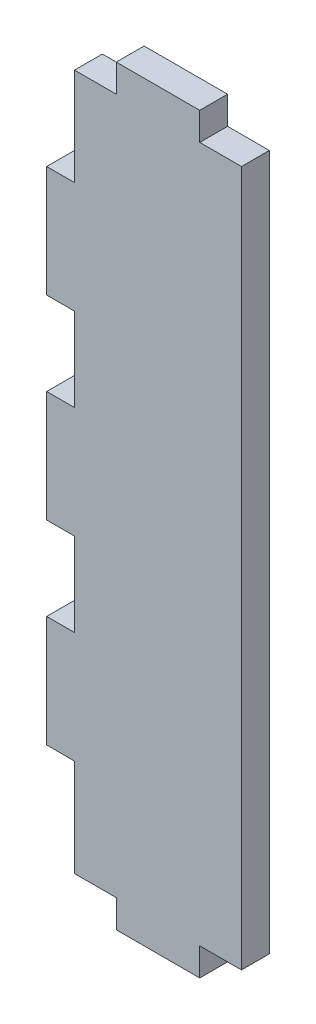
ISO-10303-21;
HEADER;
FILE_DESCRIPTION(('STEP AP214'),'2;1');
FILE_NAME('part.step','',(''),(''),'','','');
FILE_SCHEMA(('AUTOMOTIVE_DESIGN { 1 0 10303 214 1 1 1 1 }'));
ENDSEC;
DATA;
#1=APPLICATION_CONTEXT('core data for automotive mechanical design processes');
#2=APPLICATION_PROTOCOL_DEFINITION('international standard','automotive_design',2000,#1);
#3=PRODUCT_CONTEXT('',#1,'mechanical');
#4=PRODUCT('Part','Part','',(#3));
#5=PRODUCT_RELATED_PRODUCT_CATEGORY('part','',(#4));
#6=PRODUCT_DEFINITION_FORMATION('','',#4);
#7=PRODUCT_DEFINITION_CONTEXT('part definition',#1,'design');
#8=PRODUCT_DEFINITION('design','',#6,#7);
#9=PRODUCT_DEFINITION_SHAPE('','',#8);
#10=(LENGTH_UNIT() NAMED_UNIT(*) SI_UNIT(.MILLI.,.METRE.));
#11=(NAMED_UNIT(*) PLANE_ANGLE_UNIT() SI_UNIT($,.RADIAN.));
#12=(NAMED_UNIT(*) SI_UNIT($,.STERADIAN.) SOLID_ANGLE_UNIT());
#13=UNCERTAINTY_MEASURE_WITH_UNIT(LENGTH_MEASURE(1.E-05),#10,'distance_accuracy_value','');
#14=(GEOMETRIC_REPRESENTATION_CONTEXT(3) GLOBAL_UNCERTAINTY_ASSIGNED_CONTEXT((#13)) GLOBAL_UNIT_ASSIGNED_CONTEXT((#10,
#11,#12)) REPRESENTATION_CONTEXT('',''));
#15=CARTESIAN_POINT('',(0.,0.,0.));
#16=DIRECTION('',(0.,0.,1.));
#17=DIRECTION('',(1.,0.,0.));
#18=AXIS2_PLACEMENT_3D('',#15,#16,#17);
#19=CARTESIAN_POINT('',(0.,127.500000000005,-5.));
#20=DIRECTION('',(0.,1.,0.));
#21=DIRECTION('',(0.,0.,1.));
#22=AXIS2_PLACEMENT_3D('',#19,#20,#21);
#23=PLANE('',#22);
#24=DIRECTION('',(-1.,0.,0.));
#25=VECTOR('',#24,1.);
#26=CARTESIAN_POINT('',(0.,127.500000000005,0.));
#27=LINE('',#26,#25);
#28=CARTESIAN_POINT('',(24.9999999999886,127.500000000005,0.));
#29=VERTEX_POINT('',#28);
#30=CARTESIAN_POINT('',(19.9999999999886,127.500000000005,0.));
#31=VERTEX_POINT('',#30);
#32=EDGE_CURVE('E231',#29,#31,#27,.T.);
#33=ORIENTED_EDGE('',*,*,#32,.T.);
#34=DIRECTION('',(0.,0.,1.));
#35=VECTOR('',#34,1.);
#36=CARTESIAN_POINT('',(19.9999999999886,127.500000000005,-5.));
#37=LINE('',#36,#35);
#38=CARTESIAN_POINT('',(19.9999999999886,127.500000000005,-5.));
#39=VERTEX_POINT('',#38);
#40=EDGE_CURVE('E11',#39,#31,#37,.T.);
#41=ORIENTED_EDGE('',*,*,#40,.F.);
#42=DIRECTION('',(-1.,0.,0.));
#43=VECTOR('',#42,1.);
#44=CARTESIAN_POINT('',(0.,127.500000000005,-5.));
#45=LINE('',#44,#43);
#46=CARTESIAN_POINT('',(24.9999999999886,127.500000000005,-5.));
#47=VERTEX_POINT('',#46);
#48=EDGE_CURVE('E57',#47,#39,#45,.T.);
#49=ORIENTED_EDGE('',*,*,#48,.F.);
#50=DIRECTION('',(0.,0.,1.));
#51=VECTOR('',#50,1.);
#52=CARTESIAN_POINT('',(24.9999999999886,127.500000000005,-5.));
#53=LINE('',#52,#51);
#54=EDGE_CURVE('E42',#47,#29,#53,.T.);
#55=ORIENTED_EDGE('',*,*,#54,.T.);
#56=EDGE_LOOP('',(#33,#41,#49,#55));
#57=FACE_BOUND('',#56,.T.);
#58=ADVANCED_FACE('F39',(#57),#23,.F.);
#59=CARTESIAN_POINT('',(19.9999999999886,0.,-5.));
#60=DIRECTION('',(-1.,0.,0.));
#61=DIRECTION('',(0.,0.,1.));
#62=AXIS2_PLACEMENT_3D('',#59,#60,#61);
#63=PLANE('',#62);
#64=DIRECTION('',(0.,-1.,0.));
#65=VECTOR('',#64,1.);
#66=CARTESIAN_POINT('',(19.9999999999886,0.,0.));
#67=LINE('',#66,#65);
#68=CARTESIAN_POINT('',(19.9999999999886,147.500000000005,0.));
#69=VERTEX_POINT('',#68);
#70=EDGE_CURVE('E293',#69,#31,#67,.T.);
#71=ORIENTED_EDGE('',*,*,#70,.F.);
#72=DIRECTION('',(0.,0.,1.));
#73=VECTOR('',#72,1.);
#74=CARTESIAN_POINT('',(19.9999999999886,147.500000000005,-5.));
#75=LINE('',#74,#73);
#76=CARTESIAN_POINT('',(19.9999999999886,147.500000000005,-5.));
#77=VERTEX_POINT('',#76);
#78=EDGE_CURVE('E48',#77,#69,#75,.T.);
#79=ORIENTED_EDGE('',*,*,#78,.F.);
#80=DIRECTION('',(0.,-1.,0.));
#81=VECTOR('',#80,1.);
#82=CARTESIAN_POINT('',(19.9999999999886,0.,-5.));
#83=LINE('',#82,#81);
#84=EDGE_CURVE('E220',#77,#39,#83,.T.);
#85=ORIENTED_EDGE('',*,*,#84,.T.);
#86=ORIENTED_EDGE('',*,*,#40,.T.);
#87=EDGE_LOOP('',(#71,#79,#85,#86));
#88=FACE_BOUND('',#87,.T.);
#89=ADVANCED_FACE('F354',(#88),#63,.T.);
#90=CARTESIAN_POINT('',(0.,147.500000000005,-5.));
#91=DIRECTION('',(0.,1.,0.));
#92=DIRECTION('',(0.,0.,1.));
#93=AXIS2_PLACEMENT_3D('',#90,#91,#92);
#94=PLANE('',#93);
#95=DIRECTION('',(-1.,0.,0.));
#96=VECTOR('',#95,1.);
#97=CARTESIAN_POINT('',(0.,147.500000000005,0.));
#98=LINE('',#97,#96);
#99=CARTESIAN_POINT('',(24.9999999999886,147.500000000005,0.));
#100=VERTEX_POINT('',#99);
#101=EDGE_CURVE('E210',#100,#69,#98,.T.);
#102=ORIENTED_EDGE('',*,*,#101,.F.);
#103=DIRECTION('',(0.,0.,1.));
#104=VECTOR('',#103,1.);
#105=CARTESIAN_POINT('',(24.9999999999886,147.500000000005,-5.));
#106=LINE('',#105,#104);
#107=CARTESIAN_POINT('',(24.9999999999886,147.500000000005,-5.));
#108=VERTEX_POINT('',#107);
#109=EDGE_CURVE('E206',#108,#100,#106,.T.);
#110=ORIENTED_EDGE('',*,*,#109,.F.);
#111=DIRECTION('',(-1.,0.,0.));
#112=VECTOR('',#111,1.);
#113=CARTESIAN_POINT('',(0.,147.500000000005,-5.));
#114=LINE('',#113,#112);
#115=EDGE_CURVE('E209',#108,#77,#114,.T.);
#116=ORIENTED_EDGE('',*,*,#115,.T.);
#117=ORIENTED_EDGE('',*,*,#78,.T.);
#118=EDGE_LOOP('',(#102,#110,#116,#117));
#119=FACE_BOUND('',#118,.T.);
#120=ADVANCED_FACE('F208',(#119),#94,.T.);
#121=CARTESIAN_POINT('',(24.9999999999886,0.,-5.));
#122=DIRECTION('',(-1.,0.,0.));
#123=DIRECTION('',(0.,-1.,0.));
#124=AXIS2_PLACEMENT_3D('',#121,#122,#123);
#125=PLANE('',#124);
#126=DIRECTION('',(0.,-1.,0.));
#127=VECTOR('',#126,1.);
#128=CARTESIAN_POINT('',(24.9999999999886,0.,0.));
#129=LINE('',#128,#127);
#130=CARTESIAN_POINT('',(24.9999999999886,165.000000000005,0.));
#131=VERTEX_POINT('',#130);
#132=EDGE_CURVE('E290',#131,#100,#129,.T.);
#133=ORIENTED_EDGE('',*,*,#132,.F.);
#134=DIRECTION('',(0.,0.,1.));
#135=VECTOR('',#134,1.);
#136=CARTESIAN_POINT('',(24.9999999999886,165.000000000005,-5.));
#137=LINE('',#136,#135);
#138=CARTESIAN_POINT('',(24.9999999999886,165.000000000005,-5.));
#139=VERTEX_POINT('',#138);
#140=EDGE_CURVE('E215',#139,#131,#137,.T.);
#141=ORIENTED_EDGE('',*,*,#140,.F.);
#142=DIRECTION('',(0.,-1.,0.));
#143=VECTOR('',#142,1.);
#144=CARTESIAN_POINT('',(24.9999999999886,0.,-5.));
#145=LINE('',#144,#143);
#146=EDGE_CURVE('E219',#139,#108,#145,.T.);
#147=ORIENTED_EDGE('',*,*,#146,.T.);
#148=ORIENTED_EDGE('',*,*,#109,.T.);
#149=EDGE_LOOP('',(#133,#141,#147,#148));
#150=FACE_BOUND('',#149,.T.);
#151=ADVANCED_FACE('F222',(#150),#125,.T.);
#152=CARTESIAN_POINT('',(0.,165.000000000005,-5.));
#153=DIRECTION('',(0.,-1.,0.));
#154=DIRECTION('',(0.,0.,-1.));
#155=AXIS2_PLACEMENT_3D('',#152,#153,#154);
#156=PLANE('',#155);
#157=DIRECTION('',(1.,0.,0.));
#158=VECTOR('',#157,1.);
#159=CARTESIAN_POINT('',(0.,165.000000000005,0.));
#160=LINE('',#159,#158);
#161=CARTESIAN_POINT('',(32.4999999999886,165.000000000005,0.));
#162=VERTEX_POINT('',#161);
#163=EDGE_CURVE('E288',#131,#162,#160,.T.);
#164=ORIENTED_EDGE('',*,*,#163,.T.);
#165=DIRECTION('',(0.,0.,1.));
#166=VECTOR('',#165,1.);
#167=CARTESIAN_POINT('',(32.4999999999886,165.000000000005,-5.));
#168=LINE('',#167,#166);
#169=CARTESIAN_POINT('',(32.4999999999886,165.000000000005,-5.));
#170=VERTEX_POINT('',#169);
#171=EDGE_CURVE('E298',#170,#162,#168,.T.);
#172=ORIENTED_EDGE('',*,*,#171,.F.);
#173=DIRECTION('',(1.,0.,0.));
#174=VECTOR('',#173,1.);
#175=CARTESIAN_POINT('',(0.,165.000000000005,-5.));
#176=LINE('',#175,#174);
#177=EDGE_CURVE('E224',#139,#170,#176,.T.);
#178=ORIENTED_EDGE('',*,*,#177,.F.);
#179=ORIENTED_EDGE('',*,*,#140,.T.);
#180=EDGE_LOOP('',(#164,#172,#178,#179));
#181=FACE_BOUND('',#180,.T.);
#182=ADVANCED_FACE('F367',(#181),#156,.F.);
#183=CARTESIAN_POINT('',(32.4999999999886,0.,-5.));
#184=DIRECTION('',(1.,0.,0.));
#185=DIRECTION('',(0.,0.,-1.));
#186=AXIS2_PLACEMENT_3D('',#183,#184,#185);
#187=PLANE('',#186);
#188=DIRECTION('',(0.,1.,0.));
#189=VECTOR('',#188,1.);
#190=CARTESIAN_POINT('',(32.4999999999886,0.,0.));
#191=LINE('',#190,#189);
#192=CARTESIAN_POINT('',(32.4999999999886,170.000000000005,0.));
#193=VERTEX_POINT('',#192);
#194=EDGE_CURVE('E285',#162,#193,#191,.T.);
#195=ORIENTED_EDGE('',*,*,#194,.T.);
#196=DIRECTION('',(0.,0.,1.));
#197=VECTOR('',#196,1.);
#198=CARTESIAN_POINT('',(32.4999999999886,170.000000000005,-5.));
#199=LINE('',#198,#197);
#200=CARTESIAN_POINT('',(32.4999999999886,170.000000000005,-5.));
#201=VERTEX_POINT('',#200);
#202=EDGE_CURVE('E301',#201,#193,#199,.T.);
#203=ORIENTED_EDGE('',*,*,#202,.F.);
#204=DIRECTION('',(0.,1.,0.));
#205=VECTOR('',#204,1.);
#206=CARTESIAN_POINT('',(32.4999999999886,0.,-5.));
#207=LINE('',#206,#205);
#208=EDGE_CURVE('E226',#170,#201,#207,.T.);
#209=ORIENTED_EDGE('',*,*,#208,.F.);
#210=ORIENTED_EDGE('',*,*,#171,.T.);
#211=EDGE_LOOP('',(#195,#203,#209,#210));
#212=FACE_BOUND('',#211,.T.);
#213=ADVANCED_FACE('F370',(#212),#187,.F.);
#214=CARTESIAN_POINT('',(0.,170.000000000005,-5.));
#215=DIRECTION('',(0.,1.,0.));
#216=DIRECTION('',(0.,0.,1.));
#217=AXIS2_PLACEMENT_3D('',#214,#215,#216);
#218=PLANE('',#217);
#219=DIRECTION('',(-1.,0.,0.));
#220=VECTOR('',#219,1.);
#221=CARTESIAN_POINT('',(0.,170.000000000005,0.));
#222=LINE('',#221,#220);
#223=CARTESIAN_POINT('',(47.4999999999886,170.000000000005,0.));
#224=VERTEX_POINT('',#223);
#225=EDGE_CURVE('E282',#224,#193,#222,.T.);
#226=ORIENTED_EDGE('',*,*,#225,.F.);
#227=DIRECTION('',(0.,0.,1.));
#228=VECTOR('',#227,1.);
#229=CARTESIAN_POINT('',(47.4999999999886,170.000000000005,-5.));
#230=LINE('',#229,#228);
#231=CARTESIAN_POINT('',(47.4999999999886,170.000000000005,-5.));
#232=VERTEX_POINT('',#231);
#233=EDGE_CURVE('E303',#232,#224,#230,.T.);
#234=ORIENTED_EDGE('',*,*,#233,.F.);
#235=DIRECTION('',(-1.,0.,0.));
#236=VECTOR('',#235,1.);
#237=CARTESIAN_POINT('',(0.,170.000000000005,-5.));
#238=LINE('',#237,#236);
#239=EDGE_CURVE('E490',#232,#201,#238,.T.);
#240=ORIENTED_EDGE('',*,*,#239,.T.);
#241=ORIENTED_EDGE('',*,*,#202,.T.);
#242=EDGE_LOOP('',(#226,#234,#240,#241));
#243=FACE_BOUND('',#242,.T.);
#244=ADVANCED_FACE('F374',(#243),#218,.T.);
#245=CARTESIAN_POINT('',(47.4999999999886,0.,-5.));
#246=DIRECTION('',(1.,0.,0.));
#247=DIRECTION('',(0.,0.,-1.));
#248=AXIS2_PLACEMENT_3D('',#245,#246,#247);
#249=PLANE('',#248);
#250=DIRECTION('',(0.,1.,0.));
#251=VECTOR('',#250,1.);
#252=CARTESIAN_POINT('',(47.4999999999886,0.,0.));
#253=LINE('',#252,#251);
#254=CARTESIAN_POINT('',(47.4999999999886,165.000000000005,0.));
#255=VERTEX_POINT('',#254);
#256=EDGE_CURVE('E279',#255,#224,#253,.T.);
#257=ORIENTED_EDGE('',*,*,#256,.F.);
#258=DIRECTION('',(0.,0.,1.));
#259=VECTOR('',#258,1.);
#260=CARTESIAN_POINT('',(47.4999999999886,165.000000000005,-5.));
#261=LINE('',#260,#259);
#262=CARTESIAN_POINT('',(47.4999999999886,165.000000000005,-5.));
#263=VERTEX_POINT('',#262);
#264=EDGE_CURVE('E305',#263,#255,#261,.T.);
#265=ORIENTED_EDGE('',*,*,#264,.F.);
#266=DIRECTION('',(0.,1.,0.));
#267=VECTOR('',#266,1.);
#268=CARTESIAN_POINT('',(47.4999999999886,0.,-5.));
#269=LINE('',#268,#267);
#270=EDGE_CURVE('E487',#263,#232,#269,.T.);
#271=ORIENTED_EDGE('',*,*,#270,.T.);
#272=ORIENTED_EDGE('',*,*,#233,.T.);
#273=EDGE_LOOP('',(#257,#265,#271,#272));
#274=FACE_BOUND('',#273,.T.);
#275=ADVANCED_FACE('F378',(#274),#249,.T.);
#276=CARTESIAN_POINT('',(0.,165.000000000005,-5.));
#277=DIRECTION('',(0.,-1.,0.));
#278=DIRECTION('',(0.,0.,-1.));
#279=AXIS2_PLACEMENT_3D('',#276,#277,#278);
#280=PLANE('',#279);
#281=DIRECTION('',(1.,0.,0.));
#282=VECTOR('',#281,1.);
#283=CARTESIAN_POINT('',(0.,165.000000000005,0.));
#284=LINE('',#283,#282);
#285=CARTESIAN_POINT('',(54.9999999999886,165.000000000005,0.));
#286=VERTEX_POINT('',#285);
#287=EDGE_CURVE('E277',#255,#286,#284,.T.);
#288=ORIENTED_EDGE('',*,*,#287,.T.);
#289=DIRECTION('',(0.,0.,1.));
#290=VECTOR('',#289,1.);
#291=CARTESIAN_POINT('',(54.9999999999886,165.000000000005,-5.));
#292=LINE('',#291,#290);
#293=CARTESIAN_POINT('',(54.9999999999886,165.000000000005,-5.));
#294=VERTEX_POINT('',#293);
#295=EDGE_CURVE('E307',#294,#286,#292,.T.);
#296=ORIENTED_EDGE('',*,*,#295,.F.);
#297=DIRECTION('',(1.,0.,0.));
#298=VECTOR('',#297,1.);
#299=CARTESIAN_POINT('',(0.,165.000000000005,-5.));
#300=LINE('',#299,#298);
#301=EDGE_CURVE('E485',#263,#294,#300,.T.);
#302=ORIENTED_EDGE('',*,*,#301,.F.);
#303=ORIENTED_EDGE('',*,*,#264,.T.);
#304=EDGE_LOOP('',(#288,#296,#302,#303));
#305=FACE_BOUND('',#304,.T.);
#306=ADVANCED_FACE('F382',(#305),#280,.F.);
#307=CARTESIAN_POINT('',(54.9999999999886,0.,-5.));
#308=DIRECTION('',(-1.,0.,0.));
#309=DIRECTION('',(0.,-1.,0.));
#310=AXIS2_PLACEMENT_3D('',#307,#308,#309);
#311=PLANE('',#310);
#312=DIRECTION('',(0.,-1.,0.));
#313=VECTOR('',#312,1.);
#314=CARTESIAN_POINT('',(54.9999999999886,0.,0.));
#315=LINE('',#314,#313);
#316=CARTESIAN_POINT('',(54.9999999999886,40.0000000000049,0.));
#317=VERTEX_POINT('',#316);
#318=EDGE_CURVE('E274',#286,#317,#315,.T.);
#319=ORIENTED_EDGE('',*,*,#318,.T.);
#320=DIRECTION('',(0.,0.,1.));
#321=VECTOR('',#320,1.);
#322=CARTESIAN_POINT('',(54.9999999999886,40.0000000000049,-5.));
#323=LINE('',#322,#321);
#324=CARTESIAN_POINT('',(54.9999999999886,40.0000000000049,-5.));
#325=VERTEX_POINT('',#324);
#326=EDGE_CURVE('E310',#325,#317,#323,.T.);
#327=ORIENTED_EDGE('',*,*,#326,.F.);
#328=DIRECTION('',(0.,-1.,0.));
#329=VECTOR('',#328,1.);
#330=CARTESIAN_POINT('',(54.9999999999886,0.,-5.));
#331=LINE('',#330,#329);
#332=EDGE_CURVE('E483',#294,#325,#331,.T.);
#333=ORIENTED_EDGE('',*,*,#332,.F.);
#334=ORIENTED_EDGE('',*,*,#295,.T.);
#335=EDGE_LOOP('',(#319,#327,#333,#334));
#336=FACE_BOUND('',#335,.T.);
#337=ADVANCED_FACE('F386',(#336),#311,.F.);
#338=CARTESIAN_POINT('',(0.,40.000000000005,-5.));
#339=DIRECTION('',(0.,-1.,0.));
#340=DIRECTION('',(1.,0.,0.));
#341=AXIS2_PLACEMENT_3D('',#338,#339,#340);
#342=PLANE('',#341);
#343=DIRECTION('',(1.,0.,0.));
#344=VECTOR('',#343,1.);
#345=CARTESIAN_POINT('',(0.,40.000000000005,0.));
#346=LINE('',#345,#344);
#347=CARTESIAN_POINT('',(47.4999999999886,40.0000000000049,0.));
#348=VERTEX_POINT('',#347);
#349=EDGE_CURVE('E271',#348,#317,#346,.T.);
#350=ORIENTED_EDGE('',*,*,#349,.F.);
#351=DIRECTION('',(0.,0.,1.));
#352=VECTOR('',#351,1.);
#353=CARTESIAN_POINT('',(47.4999999999886,40.0000000000049,-5.));
#354=LINE('',#353,#352);
#355=CARTESIAN_POINT('',(47.4999999999886,40.0000000000049,-5.));
#356=VERTEX_POINT('',#355);
#357=EDGE_CURVE('E312',#356,#348,#354,.T.);
#358=ORIENTED_EDGE('',*,*,#357,.F.);
#359=DIRECTION('',(1.,0.,0.));
#360=VECTOR('',#359,1.);
#361=CARTESIAN_POINT('',(0.,40.000000000005,-5.));
#362=LINE('',#361,#360);
#363=EDGE_CURVE('E480',#356,#325,#362,.T.);
#364=ORIENTED_EDGE('',*,*,#363,.T.);
#365=ORIENTED_EDGE('',*,*,#326,.T.);
#366=EDGE_LOOP('',(#350,#358,#364,#365));
#367=FACE_BOUND('',#366,.T.);
#368=ADVANCED_FACE('F390',(#367),#342,.T.);
#369=CARTESIAN_POINT('',(47.4999999999886,0.,-5.));
#370=DIRECTION('',(-1.,0.,0.));
#371=DIRECTION('',(0.,0.,1.));
#372=AXIS2_PLACEMENT_3D('',#369,#370,#371);
#373=PLANE('',#372);
#374=DIRECTION('',(0.,-1.,0.));
#375=VECTOR('',#374,1.);
#376=CARTESIAN_POINT('',(47.4999999999886,0.,0.));
#377=LINE('',#376,#375);
#378=CARTESIAN_POINT('',(47.4999999999886,35.0000000000049,0.));
#379=VERTEX_POINT('',#378);
#380=EDGE_CURVE('E269',#348,#379,#377,.T.);
#381=ORIENTED_EDGE('',*,*,#380,.T.);
#382=DIRECTION('',(0.,0.,1.));
#383=VECTOR('',#382,1.);
#384=CARTESIAN_POINT('',(47.4999999999886,35.0000000000049,-5.));
#385=LINE('',#384,#383);
#386=CARTESIAN_POINT('',(47.4999999999886,35.0000000000049,-5.));
#387=VERTEX_POINT('',#386);
#388=EDGE_CURVE('E314',#387,#379,#385,.T.);
#389=ORIENTED_EDGE('',*,*,#388,.F.);
#390=DIRECTION('',(0.,-1.,0.));
#391=VECTOR('',#390,1.);
#392=CARTESIAN_POINT('',(47.4999999999886,0.,-5.));
#393=LINE('',#392,#391);
#394=EDGE_CURVE('E478',#356,#387,#393,.T.);
#395=ORIENTED_EDGE('',*,*,#394,.F.);
#396=ORIENTED_EDGE('',*,*,#357,.T.);
#397=EDGE_LOOP('',(#381,#389,#395,#396));
#398=FACE_BOUND('',#397,.T.);
#399=ADVANCED_FACE('F394',(#398),#373,.F.);
#400=CARTESIAN_POINT('',(0.,35.0000000000049,-5.));
#401=DIRECTION('',(0.,1.,0.));
#402=DIRECTION('',(0.,0.,1.));
#403=AXIS2_PLACEMENT_3D('',#400,#401,#402);
#404=PLANE('',#403);
#405=DIRECTION('',(-1.,0.,0.));
#406=VECTOR('',#405,1.);
#407=CARTESIAN_POINT('',(0.,35.0000000000049,0.));
#408=LINE('',#407,#406);
#409=CARTESIAN_POINT('',(32.4999999999886,35.0000000000049,0.));
#410=VERTEX_POINT('',#409);
#411=EDGE_CURVE('E266',#379,#410,#408,.T.);
#412=ORIENTED_EDGE('',*,*,#411,.T.);
#413=DIRECTION('',(0.,0.,1.));
#414=VECTOR('',#413,1.);
#415=CARTESIAN_POINT('',(32.4999999999886,35.0000000000049,-5.));
#416=LINE('',#415,#414);
#417=CARTESIAN_POINT('',(32.4999999999886,35.0000000000049,-5.));
#418=VERTEX_POINT('',#417);
#419=EDGE_CURVE('E317',#418,#410,#416,.T.);
#420=ORIENTED_EDGE('',*,*,#419,.F.);
#421=DIRECTION('',(-1.,0.,0.));
#422=VECTOR('',#421,1.);
#423=CARTESIAN_POINT('',(0.,35.0000000000049,-5.));
#424=LINE('',#423,#422);
#425=EDGE_CURVE('E476',#387,#418,#424,.T.);
#426=ORIENTED_EDGE('',*,*,#425,.F.);
#427=ORIENTED_EDGE('',*,*,#388,.T.);
#428=EDGE_LOOP('',(#412,#420,#426,#427));
#429=FACE_BOUND('',#428,.T.);
#430=ADVANCED_FACE('F398',(#429),#404,.F.);
#431=CARTESIAN_POINT('',(32.4999999999886,0.,-5.));
#432=DIRECTION('',(-1.,0.,0.));
#433=DIRECTION('',(0.,0.,1.));
#434=AXIS2_PLACEMENT_3D('',#431,#432,#433);
#435=PLANE('',#434);
#436=DIRECTION('',(0.,-1.,0.));
#437=VECTOR('',#436,1.);
#438=CARTESIAN_POINT('',(32.4999999999886,0.,0.));
#439=LINE('',#438,#437);
#440=CARTESIAN_POINT('',(32.4999999999886,40.0000000000049,0.));
#441=VERTEX_POINT('',#440);
#442=EDGE_CURVE('E263',#441,#410,#439,.T.);
#443=ORIENTED_EDGE('',*,*,#442,.F.);
#444=DIRECTION('',(0.,0.,1.));
#445=VECTOR('',#444,1.);
#446=CARTESIAN_POINT('',(32.4999999999886,40.0000000000049,-5.));
#447=LINE('',#446,#445);
#448=CARTESIAN_POINT('',(32.4999999999886,40.0000000000049,-5.));
#449=VERTEX_POINT('',#448);
#450=EDGE_CURVE('E319',#449,#441,#447,.T.);
#451=ORIENTED_EDGE('',*,*,#450,.F.);
#452=DIRECTION('',(0.,-1.,0.));
#453=VECTOR('',#452,1.);
#454=CARTESIAN_POINT('',(32.4999999999886,0.,-5.));
#455=LINE('',#454,#453);
#456=EDGE_CURVE('E473',#449,#418,#455,.T.);
#457=ORIENTED_EDGE('',*,*,#456,.T.);
#458=ORIENTED_EDGE('',*,*,#419,.T.);
#459=EDGE_LOOP('',(#443,#451,#457,#458));
#460=FACE_BOUND('',#459,.T.);
#461=ADVANCED_FACE('F402',(#460),#435,.T.);
#462=CARTESIAN_POINT('',(0.,40.0000000000049,-5.));
#463=DIRECTION('',(0.,-1.,0.));
#464=DIRECTION('',(0.,0.,-1.));
#465=AXIS2_PLACEMENT_3D('',#462,#463,#464);
#466=PLANE('',#465);
#467=DIRECTION('',(1.,0.,0.));
#468=VECTOR('',#467,1.);
#469=CARTESIAN_POINT('',(0.,40.0000000000049,0.));
#470=LINE('',#469,#468);
#471=CARTESIAN_POINT('',(24.9999999999886,40.0000000000049,0.));
#472=VERTEX_POINT('',#471);
#473=EDGE_CURVE('E260',#472,#441,#470,.T.);
#474=ORIENTED_EDGE('',*,*,#473,.F.);
#475=DIRECTION('',(0.,0.,1.));
#476=VECTOR('',#475,1.);
#477=CARTESIAN_POINT('',(24.9999999999886,40.0000000000049,-5.));
#478=LINE('',#477,#476);
#479=CARTESIAN_POINT('',(24.9999999999886,40.0000000000049,-5.));
#480=VERTEX_POINT('',#479);
#481=EDGE_CURVE('E321',#480,#472,#478,.T.);
#482=ORIENTED_EDGE('',*,*,#481,.F.);
#483=DIRECTION('',(1.,0.,0.));
#484=VECTOR('',#483,1.);
#485=CARTESIAN_POINT('',(0.,40.0000000000049,-5.));
#486=LINE('',#485,#484);
#487=EDGE_CURVE('E470',#480,#449,#486,.T.);
#488=ORIENTED_EDGE('',*,*,#487,.T.);
#489=ORIENTED_EDGE('',*,*,#450,.T.);
#490=EDGE_LOOP('',(#474,#482,#488,#489));
#491=FACE_BOUND('',#490,.T.);
#492=ADVANCED_FACE('F406',(#491),#466,.T.);
#493=CARTESIAN_POINT('',(24.9999999999886,0.,-5.));
#494=DIRECTION('',(-1.,0.,0.));
#495=DIRECTION('',(0.,-1.,0.));
#496=AXIS2_PLACEMENT_3D('',#493,#494,#495);
#497=PLANE('',#496);
#498=DIRECTION('',(0.,-1.,0.));
#499=VECTOR('',#498,1.);
#500=CARTESIAN_POINT('',(24.9999999999886,0.,0.));
#501=LINE('',#500,#499);
#502=CARTESIAN_POINT('',(24.9999999999886,57.500000000005,0.));
#503=VERTEX_POINT('',#502);
#504=EDGE_CURVE('E257',#503,#472,#501,.T.);
#505=ORIENTED_EDGE('',*,*,#504,.F.);
#506=DIRECTION('',(0.,0.,1.));
#507=VECTOR('',#506,1.);
#508=CARTESIAN_POINT('',(24.9999999999886,57.500000000005,-5.));
#509=LINE('',#508,#507);
#510=CARTESIAN_POINT('',(24.9999999999886,57.500000000005,-5.));
#511=VERTEX_POINT('',#510);
#512=EDGE_CURVE('E323',#511,#503,#509,.T.);
#513=ORIENTED_EDGE('',*,*,#512,.F.);
#514=DIRECTION('',(0.,-1.,0.));
#515=VECTOR('',#514,1.);
#516=CARTESIAN_POINT('',(24.9999999999886,0.,-5.));
#517=LINE('',#516,#515);
#518=EDGE_CURVE('E467',#511,#480,#517,.T.);
#519=ORIENTED_EDGE('',*,*,#518,.T.);
#520=ORIENTED_EDGE('',*,*,#481,.T.);
#521=EDGE_LOOP('',(#505,#513,#519,#520));
#522=FACE_BOUND('',#521,.T.);
#523=ADVANCED_FACE('F410',(#522),#497,.T.);
#524=CARTESIAN_POINT('',(0.,57.500000000005,-5.));
#525=DIRECTION('',(0.,1.,0.));
#526=DIRECTION('',(0.,0.,1.));
#527=AXIS2_PLACEMENT_3D('',#524,#525,#526);
#528=PLANE('',#527);
#529=DIRECTION('',(-1.,0.,0.));
#530=VECTOR('',#529,1.);
#531=CARTESIAN_POINT('',(0.,57.500000000005,0.));
#532=LINE('',#531,#530);
#533=CARTESIAN_POINT('',(19.9999999999886,57.500000000005,0.));
#534=VERTEX_POINT('',#533);
#535=EDGE_CURVE('E254',#503,#534,#532,.T.);
#536=ORIENTED_EDGE('',*,*,#535,.T.);
#537=DIRECTION('',(0.,0.,1.));
#538=VECTOR('',#537,1.);
#539=CARTESIAN_POINT('',(19.9999999999886,57.500000000005,-5.));
#540=LINE('',#539,#538);
#541=CARTESIAN_POINT('',(19.9999999999886,57.500000000005,-5.));
#542=VERTEX_POINT('',#541);
#543=EDGE_CURVE('E325',#542,#534,#540,.T.);
#544=ORIENTED_EDGE('',*,*,#543,.F.);
#545=DIRECTION('',(-1.,0.,0.));
#546=VECTOR('',#545,1.);
#547=CARTESIAN_POINT('',(0.,57.500000000005,-5.));
#548=LINE('',#547,#546);
#549=EDGE_CURVE('E465',#511,#542,#548,.T.);
#550=ORIENTED_EDGE('',*,*,#549,.F.);
#551=ORIENTED_EDGE('',*,*,#512,.T.);
#552=EDGE_LOOP('',(#536,#544,#550,#551));
#553=FACE_BOUND('',#552,.T.);
#554=ADVANCED_FACE('F414',(#553),#528,.F.);
#555=CARTESIAN_POINT('',(19.9999999999886,0.,-5.));
#556=DIRECTION('',(-1.,0.,0.));
#557=DIRECTION('',(0.,0.,1.));
#558=AXIS2_PLACEMENT_3D('',#555,#556,#557);
#559=PLANE('',#558);
#560=DIRECTION('',(0.,-1.,0.));
#561=VECTOR('',#560,1.);
#562=CARTESIAN_POINT('',(19.9999999999886,0.,0.));
#563=LINE('',#562,#561);
#564=CARTESIAN_POINT('',(19.9999999999886,77.5000000000049,0.));
#565=VERTEX_POINT('',#564);
#566=EDGE_CURVE('E251',#565,#534,#563,.T.);
#567=ORIENTED_EDGE('',*,*,#566,.F.);
#568=DIRECTION('',(0.,0.,1.));
#569=VECTOR('',#568,1.);
#570=CARTESIAN_POINT('',(19.9999999999886,77.5000000000049,-5.));
#571=LINE('',#570,#569);
#572=CARTESIAN_POINT('',(19.9999999999886,77.5000000000049,-5.));
#573=VERTEX_POINT('',#572);
#574=EDGE_CURVE('E327',#573,#565,#571,.T.);
#575=ORIENTED_EDGE('',*,*,#574,.F.);
#576=DIRECTION('',(0.,-1.,0.));
#577=VECTOR('',#576,1.);
#578=CARTESIAN_POINT('',(19.9999999999886,0.,-5.));
#579=LINE('',#578,#577);
#580=EDGE_CURVE('E462',#573,#542,#579,.T.);
#581=ORIENTED_EDGE('',*,*,#580,.T.);
#582=ORIENTED_EDGE('',*,*,#543,.T.);
#583=EDGE_LOOP('',(#567,#575,#581,#582));
#584=FACE_BOUND('',#583,.T.);
#585=ADVANCED_FACE('F418',(#584),#559,.T.);
#586=CARTESIAN_POINT('',(0.,77.5000000000049,-5.));
#587=DIRECTION('',(0.,1.,0.));
#588=DIRECTION('',(0.,0.,1.));
#589=AXIS2_PLACEMENT_3D('',#586,#587,#588);
#590=PLANE('',#589);
#591=DIRECTION('',(-1.,0.,0.));
#592=VECTOR('',#591,1.);
#593=CARTESIAN_POINT('',(0.,77.5000000000049,0.));
#594=LINE('',#593,#592);
#595=CARTESIAN_POINT('',(24.9999999999886,77.5000000000049,0.));
#596=VERTEX_POINT('',#595);
#597=EDGE_CURVE('E248',#596,#565,#594,.T.);
#598=ORIENTED_EDGE('',*,*,#597,.F.);
#599=DIRECTION('',(0.,0.,1.));
#600=VECTOR('',#599,1.);
#601=CARTESIAN_POINT('',(24.9999999999886,77.5000000000049,-5.));
#602=LINE('',#601,#600);
#603=CARTESIAN_POINT('',(24.9999999999886,77.5000000000049,-5.));
#604=VERTEX_POINT('',#603);
#605=EDGE_CURVE('E329',#604,#596,#602,.T.);
#606=ORIENTED_EDGE('',*,*,#605,.F.);
#607=DIRECTION('',(-1.,0.,0.));
#608=VECTOR('',#607,1.);
#609=CARTESIAN_POINT('',(0.,77.5000000000049,-5.));
#610=LINE('',#609,#608);
#611=EDGE_CURVE('E459',#604,#573,#610,.T.);
#612=ORIENTED_EDGE('',*,*,#611,.T.);
#613=ORIENTED_EDGE('',*,*,#574,.T.);
#614=EDGE_LOOP('',(#598,#606,#612,#613));
#615=FACE_BOUND('',#614,.T.);
#616=ADVANCED_FACE('F422',(#615),#590,.T.);
#617=CARTESIAN_POINT('',(24.9999999999886,0.,-5.));
#618=DIRECTION('',(-1.,0.,0.));
#619=DIRECTION('',(0.,-1.,0.));
#620=AXIS2_PLACEMENT_3D('',#617,#618,#619);
#621=PLANE('',#620);
#622=DIRECTION('',(0.,-1.,0.));
#623=VECTOR('',#622,1.);
#624=CARTESIAN_POINT('',(24.9999999999886,0.,0.));
#625=LINE('',#624,#623);
#626=CARTESIAN_POINT('',(24.9999999999886,92.500000000005,0.));
#627=VERTEX_POINT('',#626);
#628=EDGE_CURVE('E245',#627,#596,#625,.T.);
#629=ORIENTED_EDGE('',*,*,#628,.F.);
#630=DIRECTION('',(0.,0.,1.));
#631=VECTOR('',#630,1.);
#632=CARTESIAN_POINT('',(24.9999999999886,92.500000000005,-5.));
#633=LINE('',#632,#631);
#634=CARTESIAN_POINT('',(24.9999999999886,92.500000000005,-5.));
#635=VERTEX_POINT('',#634);
#636=EDGE_CURVE('E331',#635,#627,#633,.T.);
#637=ORIENTED_EDGE('',*,*,#636,.F.);
#638=DIRECTION('',(0.,-1.,0.));
#639=VECTOR('',#638,1.);
#640=CARTESIAN_POINT('',(24.9999999999886,0.,-5.));
#641=LINE('',#640,#639);
#642=EDGE_CURVE('E456',#635,#604,#641,.T.);
#643=ORIENTED_EDGE('',*,*,#642,.T.);
#644=ORIENTED_EDGE('',*,*,#605,.T.);
#645=EDGE_LOOP('',(#629,#637,#643,#644));
#646=FACE_BOUND('',#645,.T.);
#647=ADVANCED_FACE('F426',(#646),#621,.T.);
#648=CARTESIAN_POINT('',(0.,92.500000000005,-5.));
#649=DIRECTION('',(0.,1.,0.));
#650=DIRECTION('',(0.,0.,1.));
#651=AXIS2_PLACEMENT_3D('',#648,#649,#650);
#652=PLANE('',#651);
#653=DIRECTION('',(-1.,0.,0.));
#654=VECTOR('',#653,1.);
#655=CARTESIAN_POINT('',(0.,92.500000000005,0.));
#656=LINE('',#655,#654);
#657=CARTESIAN_POINT('',(19.9999999999886,92.500000000005,0.));
#658=VERTEX_POINT('',#657);
#659=EDGE_CURVE('E242',#627,#658,#656,.T.);
#660=ORIENTED_EDGE('',*,*,#659,.T.);
#661=DIRECTION('',(0.,0.,1.));
#662=VECTOR('',#661,1.);
#663=CARTESIAN_POINT('',(19.9999999999886,92.500000000005,-5.));
#664=LINE('',#663,#662);
#665=CARTESIAN_POINT('',(19.9999999999886,92.500000000005,-5.));
#666=VERTEX_POINT('',#665);
#667=EDGE_CURVE('E333',#666,#658,#664,.T.);
#668=ORIENTED_EDGE('',*,*,#667,.F.);
#669=DIRECTION('',(-1.,0.,0.));
#670=VECTOR('',#669,1.);
#671=CARTESIAN_POINT('',(0.,92.500000000005,-5.));
#672=LINE('',#671,#670);
#673=EDGE_CURVE('E450',#635,#666,#672,.T.);
#674=ORIENTED_EDGE('',*,*,#673,.F.);
#675=ORIENTED_EDGE('',*,*,#636,.T.);
#676=EDGE_LOOP('',(#660,#668,#674,#675));
#677=FACE_BOUND('',#676,.T.);
#678=ADVANCED_FACE('F430',(#677),#652,.F.);
#679=CARTESIAN_POINT('',(19.9999999999886,0.,-5.));
#680=DIRECTION('',(-1.,0.,0.));
#681=DIRECTION('',(0.,0.,1.));
#682=AXIS2_PLACEMENT_3D('',#679,#680,#681);
#683=PLANE('',#682);
#684=DIRECTION('',(0.,-1.,0.));
#685=VECTOR('',#684,1.);
#686=CARTESIAN_POINT('',(19.9999999999886,0.,0.));
#687=LINE('',#686,#685);
#688=CARTESIAN_POINT('',(19.9999999999886,112.500000000005,0.));
#689=VERTEX_POINT('',#688);
#690=EDGE_CURVE('E239',#689,#658,#687,.T.);
#691=ORIENTED_EDGE('',*,*,#690,.F.);
#692=DIRECTION('',(0.,0.,1.));
#693=VECTOR('',#692,1.);
#694=CARTESIAN_POINT('',(19.9999999999886,112.500000000005,-5.));
#695=LINE('',#694,#693);
#696=CARTESIAN_POINT('',(19.9999999999886,112.500000000005,-5.));
#697=VERTEX_POINT('',#696);
#698=EDGE_CURVE('E335',#697,#689,#695,.T.);
#699=ORIENTED_EDGE('',*,*,#698,.F.);
#700=DIRECTION('',(0.,-1.,0.));
#701=VECTOR('',#700,1.);
#702=CARTESIAN_POINT('',(19.9999999999886,0.,-5.));
#703=LINE('',#702,#701);
#704=EDGE_CURVE('E447',#697,#666,#703,.T.);
#705=ORIENTED_EDGE('',*,*,#704,.T.);
#706=ORIENTED_EDGE('',*,*,#667,.T.);
#707=EDGE_LOOP('',(#691,#699,#705,#706));
#708=FACE_BOUND('',#707,.T.);
#709=ADVANCED_FACE('F350',(#708),#683,.T.);
#710=CARTESIAN_POINT('',(0.,112.500000000005,-5.));
#711=DIRECTION('',(0.,1.,0.));
#712=DIRECTION('',(0.,0.,1.));
#713=AXIS2_PLACEMENT_3D('',#710,#711,#712);
#714=PLANE('',#713);
#715=DIRECTION('',(-1.,0.,0.));
#716=VECTOR('',#715,1.);
#717=CARTESIAN_POINT('',(0.,112.500000000005,0.));
#718=LINE('',#717,#716);
#719=CARTESIAN_POINT('',(24.9999999999886,112.500000000005,0.));
#720=VERTEX_POINT('',#719);
#721=EDGE_CURVE('E236',#720,#689,#718,.T.);
#722=ORIENTED_EDGE('',*,*,#721,.F.);
#723=DIRECTION('',(0.,0.,1.));
#724=VECTOR('',#723,1.);
#725=CARTESIAN_POINT('',(24.9999999999886,112.500000000005,-5.));
#726=LINE('',#725,#724);
#727=CARTESIAN_POINT('',(24.9999999999886,112.500000000005,-5.));
#728=VERTEX_POINT('',#727);
#729=EDGE_CURVE('E336',#728,#720,#726,.T.);
#730=ORIENTED_EDGE('',*,*,#729,.F.);
#731=DIRECTION('',(-1.,0.,0.));
#732=VECTOR('',#731,1.);
#733=CARTESIAN_POINT('',(0.,112.500000000005,-5.));
#734=LINE('',#733,#732);
#735=EDGE_CURVE('E446',#728,#697,#734,.T.);
#736=ORIENTED_EDGE('',*,*,#735,.T.);
#737=ORIENTED_EDGE('',*,*,#698,.T.);
#738=EDGE_LOOP('',(#722,#730,#736,#737));
#739=FACE_BOUND('',#738,.T.);
#740=ADVANCED_FACE('F344',(#739),#714,.T.);
#741=CARTESIAN_POINT('',(24.9999999999886,0.,-5.));
#742=DIRECTION('',(-1.,0.,0.));
#743=DIRECTION('',(0.,-1.,0.));
#744=AXIS2_PLACEMENT_3D('',#741,#742,#743);
#745=PLANE('',#744);
#746=DIRECTION('',(0.,-1.,0.));
#747=VECTOR('',#746,1.);
#748=CARTESIAN_POINT('',(24.9999999999886,0.,0.));
#749=LINE('',#748,#747);
#750=EDGE_CURVE('E233',#29,#720,#749,.T.);
#751=ORIENTED_EDGE('',*,*,#750,.F.);
#752=ORIENTED_EDGE('',*,*,#54,.F.);
#753=DIRECTION('',(0.,-1.,0.));
#754=VECTOR('',#753,1.);
#755=CARTESIAN_POINT('',(24.9999999999886,0.,-5.));
#756=LINE('',#755,#754);
#757=EDGE_CURVE('E448',#47,#728,#756,.T.);
#758=ORIENTED_EDGE('',*,*,#757,.T.);
#759=ORIENTED_EDGE('',*,*,#729,.T.);
#760=EDGE_LOOP('',(#751,#752,#758,#759));
#761=FACE_BOUND('',#760,.T.);
#762=ADVANCED_FACE('F342',(#761),#745,.T.);
#763=CARTESIAN_POINT('',(0.,0.,-5.));
#764=DIRECTION('',(0.,0.,1.));
#765=DIRECTION('',(1.,0.,0.));
#766=AXIS2_PLACEMENT_3D('',#763,#764,#765);
#767=PLANE('',#766);
#768=ORIENTED_EDGE('',*,*,#48,.T.);
#769=ORIENTED_EDGE('',*,*,#84,.F.);
#770=ORIENTED_EDGE('',*,*,#115,.F.);
#771=ORIENTED_EDGE('',*,*,#146,.F.);
#772=ORIENTED_EDGE('',*,*,#177,.T.);
#773=ORIENTED_EDGE('',*,*,#208,.T.);
#774=ORIENTED_EDGE('',*,*,#239,.F.);
#775=ORIENTED_EDGE('',*,*,#270,.F.);
#776=ORIENTED_EDGE('',*,*,#301,.T.);
#777=ORIENTED_EDGE('',*,*,#332,.T.);
#778=ORIENTED_EDGE('',*,*,#363,.F.);
#779=ORIENTED_EDGE('',*,*,#394,.T.);
#780=ORIENTED_EDGE('',*,*,#425,.T.);
#781=ORIENTED_EDGE('',*,*,#456,.F.);
#782=ORIENTED_EDGE('',*,*,#487,.F.);
#783=ORIENTED_EDGE('',*,*,#518,.F.);
#784=ORIENTED_EDGE('',*,*,#549,.T.);
#785=ORIENTED_EDGE('',*,*,#580,.F.);
#786=ORIENTED_EDGE('',*,*,#611,.F.);
#787=ORIENTED_EDGE('',*,*,#642,.F.);
#788=ORIENTED_EDGE('',*,*,#673,.T.);
#789=ORIENTED_EDGE('',*,*,#704,.F.);
#790=ORIENTED_EDGE('',*,*,#735,.F.);
#791=ORIENTED_EDGE('',*,*,#757,.F.);
#792=EDGE_LOOP('',(#768,#769,#770,#771,#772,#773,#774,#775,#776,#777,#778,#779,#780,#781,#782,
#783,#784,#785,#786,#787,#788,#789,#790,#791));
#793=FACE_BOUND('',#792,.T.);
#794=ADVANCED_FACE('F218',(#793),#767,.F.);
#795=CARTESIAN_POINT('',(0.,0.,0.));
#796=DIRECTION('',(0.,0.,1.));
#797=DIRECTION('',(1.,0.,0.));
#798=AXIS2_PLACEMENT_3D('',#795,#796,#797);
#799=PLANE('',#798);
#800=ORIENTED_EDGE('',*,*,#32,.F.);
#801=ORIENTED_EDGE('',*,*,#750,.T.);
#802=ORIENTED_EDGE('',*,*,#721,.T.);
#803=ORIENTED_EDGE('',*,*,#690,.T.);
#804=ORIENTED_EDGE('',*,*,#659,.F.);
#805=ORIENTED_EDGE('',*,*,#628,.T.);
#806=ORIENTED_EDGE('',*,*,#597,.T.);
#807=ORIENTED_EDGE('',*,*,#566,.T.);
#808=ORIENTED_EDGE('',*,*,#535,.F.);
#809=ORIENTED_EDGE('',*,*,#504,.T.);
#810=ORIENTED_EDGE('',*,*,#473,.T.);
#811=ORIENTED_EDGE('',*,*,#442,.T.);
#812=ORIENTED_EDGE('',*,*,#411,.F.);
#813=ORIENTED_EDGE('',*,*,#380,.F.);
#814=ORIENTED_EDGE('',*,*,#349,.T.);
#815=ORIENTED_EDGE('',*,*,#318,.F.);
#816=ORIENTED_EDGE('',*,*,#287,.F.);
#817=ORIENTED_EDGE('',*,*,#256,.T.);
#818=ORIENTED_EDGE('',*,*,#225,.T.);
#819=ORIENTED_EDGE('',*,*,#194,.F.);
#820=ORIENTED_EDGE('',*,*,#163,.F.);
#821=ORIENTED_EDGE('',*,*,#132,.T.);
#822=ORIENTED_EDGE('',*,*,#101,.T.);
#823=ORIENTED_EDGE('',*,*,#70,.T.);
#824=EDGE_LOOP('',(#800,#801,#802,#803,#804,#805,#806,#807,#808,#809,#810,#811,#812,#813,#814,
#815,#816,#817,#818,#819,#820,#821,#822,#823));
#825=FACE_BOUND('',#824,.T.);
#826=ADVANCED_FACE('F341',(#825),#799,.T.);
#827=CLOSED_SHELL('',(#58,#89,#120,#151,#182,#213,#244,#275,#306,#337,#368,#399,#430,#461,#492,
#523,#554,#585,#616,#647,#678,#709,#740,#762,#794,#826));
#828=MANIFOLD_SOLID_BREP('B2',#827);
#829=ADVANCED_BREP_SHAPE_REPRESENTATION('',(#18,#828),#14);
#830=SHAPE_DEFINITION_REPRESENTATION(#9,#829);
ENDSEC;
END-ISO-10303-21;
